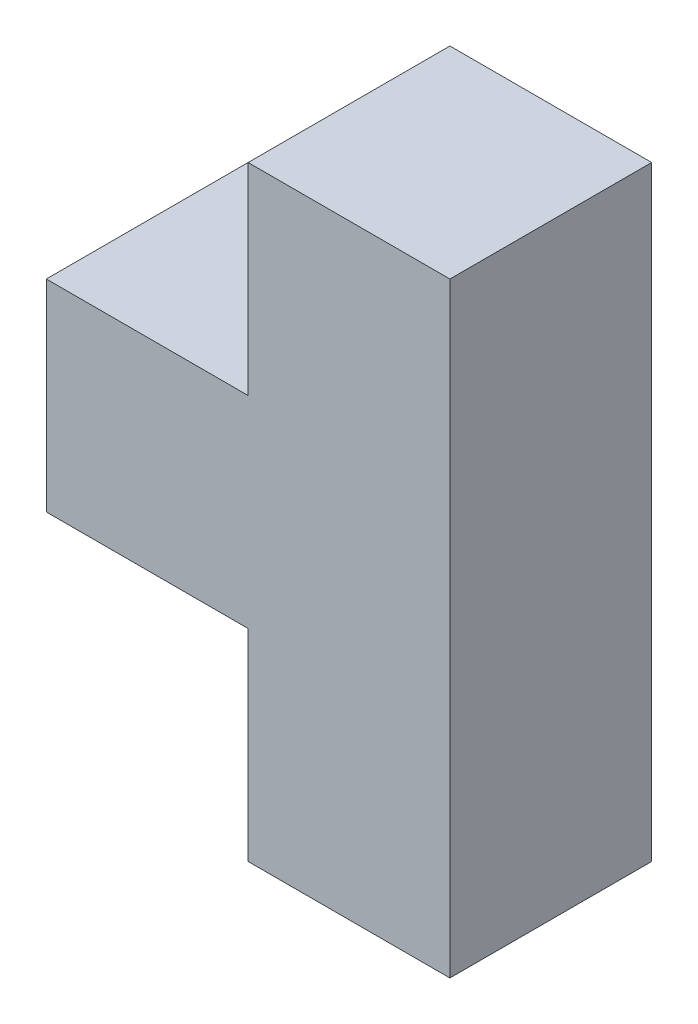
ISO-10303-21;
HEADER;
FILE_DESCRIPTION(('STEP AP214'),'2;1');
FILE_NAME('part.step','',(''),(''),'','','');
FILE_SCHEMA(('AUTOMOTIVE_DESIGN { 1 0 10303 214 1 1 1 1 }'));
ENDSEC;
DATA;
#1=APPLICATION_CONTEXT('core data for automotive mechanical design processes');
#2=APPLICATION_PROTOCOL_DEFINITION('international standard','automotive_design',2000,#1);
#3=PRODUCT_CONTEXT('',#1,'mechanical');
#4=PRODUCT('Part','Part','',(#3));
#5=PRODUCT_RELATED_PRODUCT_CATEGORY('part','',(#4));
#6=PRODUCT_DEFINITION_FORMATION('','',#4);
#7=PRODUCT_DEFINITION_CONTEXT('part definition',#1,'design');
#8=PRODUCT_DEFINITION('design','',#6,#7);
#9=PRODUCT_DEFINITION_SHAPE('','',#8);
#10=(LENGTH_UNIT() NAMED_UNIT(*) SI_UNIT(.MILLI.,.METRE.));
#11=(NAMED_UNIT(*) PLANE_ANGLE_UNIT() SI_UNIT($,.RADIAN.));
#12=(NAMED_UNIT(*) SI_UNIT($,.STERADIAN.) SOLID_ANGLE_UNIT());
#13=UNCERTAINTY_MEASURE_WITH_UNIT(LENGTH_MEASURE(1.E-05),#10,'distance_accuracy_value','');
#14=(GEOMETRIC_REPRESENTATION_CONTEXT(3) GLOBAL_UNCERTAINTY_ASSIGNED_CONTEXT((#13)) GLOBAL_UNIT_ASSIGNED_CONTEXT((#10,
#11,#12)) REPRESENTATION_CONTEXT('',''));
#15=CARTESIAN_POINT('',(0.,0.,0.));
#16=DIRECTION('',(0.,0.,1.));
#17=DIRECTION('',(1.,0.,0.));
#18=AXIS2_PLACEMENT_3D('',#15,#16,#17);
#19=CARTESIAN_POINT('',(30.,45.,15.));
#20=DIRECTION('',(0.,-1.,0.));
#21=DIRECTION('',(0.,0.,-1.));
#22=AXIS2_PLACEMENT_3D('',#19,#20,#21);
#23=PLANE('',#22);
#24=DIRECTION('',(0.,0.,1.));
#25=VECTOR('',#24,1.);
#26=CARTESIAN_POINT('',(0.,45.,-15.));
#27=LINE('',#26,#25);
#28=CARTESIAN_POINT('',(0.,45.,-15.));
#29=VERTEX_POINT('',#28);
#30=CARTESIAN_POINT('',(0.,45.,15.));
#31=VERTEX_POINT('',#30);
#32=EDGE_CURVE('E65',#29,#31,#27,.T.);
#33=ORIENTED_EDGE('',*,*,#32,.T.);
#34=DIRECTION('',(-1.,0.,0.));
#35=VECTOR('',#34,1.);
#36=CARTESIAN_POINT('',(30.,45.,15.));
#37=LINE('',#36,#35);
#38=CARTESIAN_POINT('',(30.,45.,15.));
#39=VERTEX_POINT('',#38);
#40=EDGE_CURVE('E150',#39,#31,#37,.T.);
#41=ORIENTED_EDGE('',*,*,#40,.F.);
#42=DIRECTION('',(0.,0.,-1.));
#43=VECTOR('',#42,1.);
#44=CARTESIAN_POINT('',(30.,45.,15.));
#45=LINE('',#44,#43);
#46=CARTESIAN_POINT('',(30.,45.,-15.));
#47=VERTEX_POINT('',#46);
#48=EDGE_CURVE('E50',#39,#47,#45,.T.);
#49=ORIENTED_EDGE('',*,*,#48,.T.);
#50=DIRECTION('',(-1.,0.,0.));
#51=VECTOR('',#50,1.);
#52=CARTESIAN_POINT('',(30.,45.,-15.));
#53=LINE('',#52,#51);
#54=EDGE_CURVE('E134',#47,#29,#53,.T.);
#55=ORIENTED_EDGE('',*,*,#54,.T.);
#56=EDGE_LOOP('',(#33,#41,#49,#55));
#57=FACE_BOUND('',#56,.T.);
#58=ADVANCED_FACE('F43',(#57),#23,.F.);
#59=CARTESIAN_POINT('',(-30.,-45.,15.));
#60=DIRECTION('',(1.,0.,0.));
#61=DIRECTION('',(0.,0.,-1.));
#62=AXIS2_PLACEMENT_3D('',#59,#60,#61);
#63=PLANE('',#62);
#64=DIRECTION('',(0.,-1.,0.));
#65=VECTOR('',#64,1.);
#66=CARTESIAN_POINT('',(-30.,-45.,-15.));
#67=LINE('',#66,#65);
#68=CARTESIAN_POINT('',(-30.,15.,-15.));
#69=VERTEX_POINT('',#68);
#70=CARTESIAN_POINT('',(-30.,-15.,-15.));
#71=VERTEX_POINT('',#70);
#72=EDGE_CURVE('E163',#69,#71,#67,.T.);
#73=ORIENTED_EDGE('',*,*,#72,.T.);
#74=DIRECTION('',(0.,0.,1.));
#75=VECTOR('',#74,1.);
#76=CARTESIAN_POINT('',(-30.,-15.,-15.));
#77=LINE('',#76,#75);
#78=CARTESIAN_POINT('',(-30.,-15.,15.));
#79=VERTEX_POINT('',#78);
#80=EDGE_CURVE('E57',#71,#79,#77,.T.);
#81=ORIENTED_EDGE('',*,*,#80,.T.);
#82=DIRECTION('',(0.,-1.,0.));
#83=VECTOR('',#82,1.);
#84=CARTESIAN_POINT('',(-30.,-45.,15.));
#85=LINE('',#84,#83);
#86=CARTESIAN_POINT('',(-30.,15.,15.));
#87=VERTEX_POINT('',#86);
#88=EDGE_CURVE('E153',#87,#79,#85,.T.);
#89=ORIENTED_EDGE('',*,*,#88,.F.);
#90=DIRECTION('',(0.,0.,1.));
#91=VECTOR('',#90,1.);
#92=CARTESIAN_POINT('',(-30.,15.,-15.));
#93=LINE('',#92,#91);
#94=EDGE_CURVE('E130',#69,#87,#93,.T.);
#95=ORIENTED_EDGE('',*,*,#94,.F.);
#96=EDGE_LOOP('',(#73,#81,#89,#95));
#97=FACE_BOUND('',#96,.T.);
#98=ADVANCED_FACE('F189',(#97),#63,.F.);
#99=CARTESIAN_POINT('',(0.,0.,15.));
#100=DIRECTION('',(0.,0.,-1.));
#101=DIRECTION('',(-1.,0.,0.));
#102=AXIS2_PLACEMENT_3D('',#99,#100,#101);
#103=PLANE('',#102);
#104=DIRECTION('',(-1.,0.,0.));
#105=VECTOR('',#104,1.);
#106=CARTESIAN_POINT('',(0.,-15.,15.));
#107=LINE('',#106,#105);
#108=CARTESIAN_POINT('',(0.,-15.,15.));
#109=VERTEX_POINT('',#108);
#110=EDGE_CURVE('E126',#109,#79,#107,.T.);
#111=ORIENTED_EDGE('',*,*,#110,.F.);
#112=DIRECTION('',(0.,1.,0.));
#113=VECTOR('',#112,1.);
#114=CARTESIAN_POINT('',(0.,0.,15.));
#115=LINE('',#114,#113);
#116=CARTESIAN_POINT('',(0.,-45.,15.));
#117=VERTEX_POINT('',#116);
#118=EDGE_CURVE('E113',#117,#109,#115,.T.);
#119=ORIENTED_EDGE('',*,*,#118,.F.);
#120=DIRECTION('',(1.,0.,0.));
#121=VECTOR('',#120,1.);
#122=CARTESIAN_POINT('',(30.,-45.,15.));
#123=LINE('',#122,#121);
#124=CARTESIAN_POINT('',(30.,-45.,15.));
#125=VERTEX_POINT('',#124);
#126=EDGE_CURVE('E157',#117,#125,#123,.T.);
#127=ORIENTED_EDGE('',*,*,#126,.T.);
#128=DIRECTION('',(0.,1.,0.));
#129=VECTOR('',#128,1.);
#130=CARTESIAN_POINT('',(30.,-45.,15.));
#131=LINE('',#130,#129);
#132=EDGE_CURVE('E159',#125,#39,#131,.T.);
#133=ORIENTED_EDGE('',*,*,#132,.T.);
#134=ORIENTED_EDGE('',*,*,#40,.T.);
#135=DIRECTION('',(0.,-1.,0.));
#136=VECTOR('',#135,1.);
#137=CARTESIAN_POINT('',(0.,0.,15.));
#138=LINE('',#137,#136);
#139=CARTESIAN_POINT('',(0.,15.,15.));
#140=VERTEX_POINT('',#139);
#141=EDGE_CURVE('E139',#31,#140,#138,.T.);
#142=ORIENTED_EDGE('',*,*,#141,.T.);
#143=DIRECTION('',(-1.,0.,0.));
#144=VECTOR('',#143,1.);
#145=CARTESIAN_POINT('',(0.,15.,15.));
#146=LINE('',#145,#144);
#147=EDGE_CURVE('E142',#140,#87,#146,.T.);
#148=ORIENTED_EDGE('',*,*,#147,.T.);
#149=ORIENTED_EDGE('',*,*,#88,.T.);
#150=EDGE_LOOP('',(#111,#119,#127,#133,#134,#142,#148,#149));
#151=FACE_BOUND('',#150,.T.);
#152=ADVANCED_FACE('F182',(#151),#103,.F.);
#153=CARTESIAN_POINT('',(0.,0.,-15.));
#154=DIRECTION('',(0.,0.,-1.));
#155=DIRECTION('',(-1.,0.,0.));
#156=AXIS2_PLACEMENT_3D('',#153,#154,#155);
#157=PLANE('',#156);
#158=DIRECTION('',(0.,1.,0.));
#159=VECTOR('',#158,1.);
#160=CARTESIAN_POINT('',(0.,0.,-15.));
#161=LINE('',#160,#159);
#162=CARTESIAN_POINT('',(0.,-45.,-15.));
#163=VERTEX_POINT('',#162);
#164=CARTESIAN_POINT('',(0.,-15.,-15.));
#165=VERTEX_POINT('',#164);
#166=EDGE_CURVE('E110',#163,#165,#161,.T.);
#167=ORIENTED_EDGE('',*,*,#166,.T.);
#168=DIRECTION('',(-1.,0.,0.));
#169=VECTOR('',#168,1.);
#170=CARTESIAN_POINT('',(0.,-15.,-15.));
#171=LINE('',#170,#169);
#172=EDGE_CURVE('E115',#165,#71,#171,.T.);
#173=ORIENTED_EDGE('',*,*,#172,.T.);
#174=ORIENTED_EDGE('',*,*,#72,.F.);
#175=DIRECTION('',(-1.,0.,0.));
#176=VECTOR('',#175,1.);
#177=CARTESIAN_POINT('',(0.,15.,-15.));
#178=LINE('',#177,#176);
#179=CARTESIAN_POINT('',(0.,15.,-15.));
#180=VERTEX_POINT('',#179);
#181=EDGE_CURVE('E136',#180,#69,#178,.T.);
#182=ORIENTED_EDGE('',*,*,#181,.F.);
#183=DIRECTION('',(0.,-1.,0.));
#184=VECTOR('',#183,1.);
#185=CARTESIAN_POINT('',(0.,0.,-15.));
#186=LINE('',#185,#184);
#187=EDGE_CURVE('E138',#29,#180,#186,.T.);
#188=ORIENTED_EDGE('',*,*,#187,.F.);
#189=ORIENTED_EDGE('',*,*,#54,.F.);
#190=DIRECTION('',(0.,1.,0.));
#191=VECTOR('',#190,1.);
#192=CARTESIAN_POINT('',(30.,-45.,-15.));
#193=LINE('',#192,#191);
#194=CARTESIAN_POINT('',(30.,-45.,-15.));
#195=VERTEX_POINT('',#194);
#196=EDGE_CURVE('E154',#195,#47,#193,.T.);
#197=ORIENTED_EDGE('',*,*,#196,.F.);
#198=DIRECTION('',(1.,0.,0.));
#199=VECTOR('',#198,1.);
#200=CARTESIAN_POINT('',(30.,-45.,-15.));
#201=LINE('',#200,#199);
#202=EDGE_CURVE('E125',#163,#195,#201,.T.);
#203=ORIENTED_EDGE('',*,*,#202,.F.);
#204=EDGE_LOOP('',(#167,#173,#174,#182,#188,#189,#197,#203));
#205=FACE_BOUND('',#204,.T.);
#206=ADVANCED_FACE('F123',(#205),#157,.T.);
#207=CARTESIAN_POINT('',(30.,-45.,15.));
#208=DIRECTION('',(0.,1.,0.));
#209=DIRECTION('',(0.,0.,1.));
#210=AXIS2_PLACEMENT_3D('',#207,#208,#209);
#211=PLANE('',#210);
#212=ORIENTED_EDGE('',*,*,#126,.F.);
#213=DIRECTION('',(0.,0.,1.));
#214=VECTOR('',#213,1.);
#215=CARTESIAN_POINT('',(0.,-45.,-15.));
#216=LINE('',#215,#214);
#217=EDGE_CURVE('E132',#163,#117,#216,.T.);
#218=ORIENTED_EDGE('',*,*,#217,.F.);
#219=ORIENTED_EDGE('',*,*,#202,.T.);
#220=DIRECTION('',(0.,0.,-1.));
#221=VECTOR('',#220,1.);
#222=CARTESIAN_POINT('',(30.,-45.,15.));
#223=LINE('',#222,#221);
#224=EDGE_CURVE('E11',#125,#195,#223,.T.);
#225=ORIENTED_EDGE('',*,*,#224,.F.);
#226=EDGE_LOOP('',(#212,#218,#219,#225));
#227=FACE_BOUND('',#226,.T.);
#228=ADVANCED_FACE('F187',(#227),#211,.F.);
#229=CARTESIAN_POINT('',(30.,-45.,15.));
#230=DIRECTION('',(-1.,0.,0.));
#231=DIRECTION('',(0.,0.,1.));
#232=AXIS2_PLACEMENT_3D('',#229,#230,#231);
#233=PLANE('',#232);
#234=ORIENTED_EDGE('',*,*,#196,.T.);
#235=ORIENTED_EDGE('',*,*,#48,.F.);
#236=ORIENTED_EDGE('',*,*,#132,.F.);
#237=ORIENTED_EDGE('',*,*,#224,.T.);
#238=EDGE_LOOP('',(#234,#235,#236,#237));
#239=FACE_BOUND('',#238,.T.);
#240=ADVANCED_FACE('F185',(#239),#233,.F.);
#241=CARTESIAN_POINT('',(0.,15.,-15.));
#242=DIRECTION('',(0.,1.,0.));
#243=DIRECTION('',(-1.,0.,0.));
#244=AXIS2_PLACEMENT_3D('',#241,#242,#243);
#245=PLANE('',#244);
#246=ORIENTED_EDGE('',*,*,#147,.F.);
#247=DIRECTION('',(0.,0.,1.));
#248=VECTOR('',#247,1.);
#249=CARTESIAN_POINT('',(0.,15.,-15.));
#250=LINE('',#249,#248);
#251=EDGE_CURVE('E141',#180,#140,#250,.T.);
#252=ORIENTED_EDGE('',*,*,#251,.F.);
#253=ORIENTED_EDGE('',*,*,#181,.T.);
#254=ORIENTED_EDGE('',*,*,#94,.T.);
#255=EDGE_LOOP('',(#246,#252,#253,#254));
#256=FACE_BOUND('',#255,.T.);
#257=ADVANCED_FACE('F178',(#256),#245,.T.);
#258=CARTESIAN_POINT('',(0.,0.,-15.));
#259=DIRECTION('',(-1.,0.,0.));
#260=DIRECTION('',(0.,-1.,0.));
#261=AXIS2_PLACEMENT_3D('',#258,#259,#260);
#262=PLANE('',#261);
#263=ORIENTED_EDGE('',*,*,#141,.F.);
#264=ORIENTED_EDGE('',*,*,#32,.F.);
#265=ORIENTED_EDGE('',*,*,#187,.T.);
#266=ORIENTED_EDGE('',*,*,#251,.T.);
#267=EDGE_LOOP('',(#263,#264,#265,#266));
#268=FACE_BOUND('',#267,.T.);
#269=ADVANCED_FACE('F175',(#268),#262,.T.);
#270=CARTESIAN_POINT('',(0.,0.,-15.));
#271=DIRECTION('',(1.,0.,0.));
#272=DIRECTION('',(0.,1.,0.));
#273=AXIS2_PLACEMENT_3D('',#270,#271,#272);
#274=PLANE('',#273);
#275=ORIENTED_EDGE('',*,*,#118,.T.);
#276=DIRECTION('',(0.,0.,1.));
#277=VECTOR('',#276,1.);
#278=CARTESIAN_POINT('',(0.,-15.,-15.));
#279=LINE('',#278,#277);
#280=EDGE_CURVE('E107',#165,#109,#279,.T.);
#281=ORIENTED_EDGE('',*,*,#280,.F.);
#282=ORIENTED_EDGE('',*,*,#166,.F.);
#283=ORIENTED_EDGE('',*,*,#217,.T.);
#284=EDGE_LOOP('',(#275,#281,#282,#283));
#285=FACE_BOUND('',#284,.T.);
#286=ADVANCED_FACE('F108',(#285),#274,.F.);
#287=CARTESIAN_POINT('',(0.,-15.,-15.));
#288=DIRECTION('',(0.,1.,0.));
#289=DIRECTION('',(-1.,0.,0.));
#290=AXIS2_PLACEMENT_3D('',#287,#288,#289);
#291=PLANE('',#290);
#292=ORIENTED_EDGE('',*,*,#110,.T.);
#293=ORIENTED_EDGE('',*,*,#80,.F.);
#294=ORIENTED_EDGE('',*,*,#172,.F.);
#295=ORIENTED_EDGE('',*,*,#280,.T.);
#296=EDGE_LOOP('',(#292,#293,#294,#295));
#297=FACE_BOUND('',#296,.T.);
#298=ADVANCED_FACE('F117',(#297),#291,.F.);
#299=CLOSED_SHELL('',(#58,#98,#152,#206,#228,#240,#257,#269,#286,#298));
#300=MANIFOLD_SOLID_BREP('B2',#299);
#301=ADVANCED_BREP_SHAPE_REPRESENTATION('',(#18,#300),#14);
#302=SHAPE_DEFINITION_REPRESENTATION(#9,#301);
ENDSEC;
END-ISO-10303-21;
